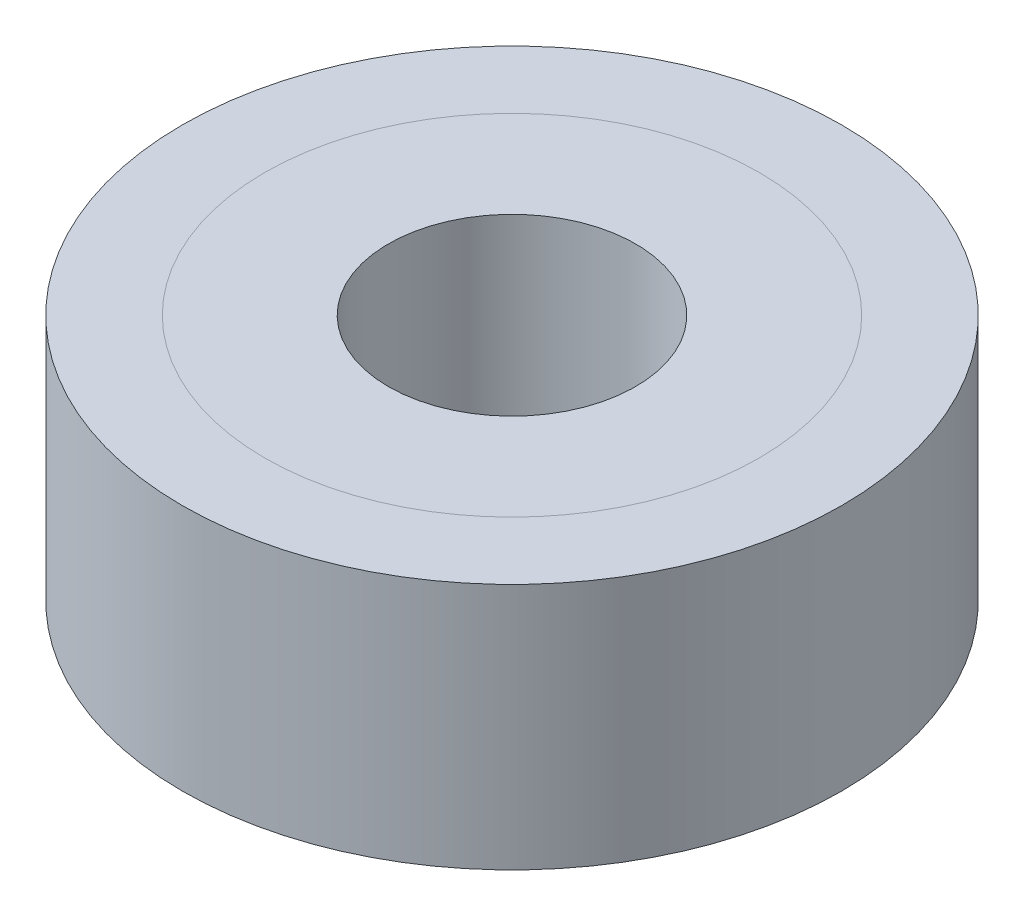
ISO-10303-21;
HEADER;
FILE_DESCRIPTION(('STEP AP214'),'2;1');
FILE_NAME('part.step','',(''),(''),'','','');
FILE_SCHEMA(('AUTOMOTIVE_DESIGN { 1 0 10303 214 1 1 1 1 }'));
ENDSEC;
DATA;
#1=APPLICATION_CONTEXT('core data for automotive mechanical design processes');
#2=APPLICATION_PROTOCOL_DEFINITION('international standard','automotive_design',2000,#1);
#3=PRODUCT_CONTEXT('',#1,'mechanical');
#4=PRODUCT('Part','Part','',(#3));
#5=PRODUCT_RELATED_PRODUCT_CATEGORY('part','',(#4));
#6=PRODUCT_DEFINITION_FORMATION('','',#4);
#7=PRODUCT_DEFINITION_CONTEXT('part definition',#1,'design');
#8=PRODUCT_DEFINITION('design','',#6,#7);
#9=PRODUCT_DEFINITION_SHAPE('','',#8);
#10=(LENGTH_UNIT() NAMED_UNIT(*) SI_UNIT(.MILLI.,.METRE.));
#11=(NAMED_UNIT(*) PLANE_ANGLE_UNIT() SI_UNIT($,.RADIAN.));
#12=(NAMED_UNIT(*) SI_UNIT($,.STERADIAN.) SOLID_ANGLE_UNIT());
#13=UNCERTAINTY_MEASURE_WITH_UNIT(LENGTH_MEASURE(1.E-05),#10,'distance_accuracy_value','');
#14=(GEOMETRIC_REPRESENTATION_CONTEXT(3) GLOBAL_UNCERTAINTY_ASSIGNED_CONTEXT((#13)) GLOBAL_UNIT_ASSIGNED_CONTEXT((#10,
#11,#12)) REPRESENTATION_CONTEXT('',''));
#15=CARTESIAN_POINT('',(0.,0.,0.));
#16=DIRECTION('',(0.,0.,1.));
#17=DIRECTION('',(1.,0.,0.));
#18=AXIS2_PLACEMENT_3D('',#15,#16,#17);
#19=CARTESIAN_POINT('',(0.,-0.01,0.));
#20=DIRECTION('',(0.,1.,0.));
#21=DIRECTION('',(0.,0.,1.));
#22=AXIS2_PLACEMENT_3D('',#19,#20,#21);
#23=CYLINDRICAL_SURFACE('',#22,3.);
#24=CARTESIAN_POINT('',(0.,0.,0.));
#25=DIRECTION('',(0.,1.,0.));
#26=DIRECTION('',(0.,0.,1.));
#27=AXIS2_PLACEMENT_3D('',#24,#25,#26);
#28=CIRCLE('',#27,3.);
#29=CARTESIAN_POINT('',(0.,0.,3.));
#30=VERTEX_POINT('',#29);
#31=EDGE_CURVE('E44',#30,#30,#28,.T.);
#32=ORIENTED_EDGE('',*,*,#31,.T.);
#33=EDGE_LOOP('',(#32));
#34=FACE_BOUND('',#33,.T.);
#35=CARTESIAN_POINT('',(0.,3.,0.));
#36=DIRECTION('',(0.,1.,0.));
#37=DIRECTION('',(0.,0.,1.));
#38=AXIS2_PLACEMENT_3D('',#35,#36,#37);
#39=CIRCLE('',#38,3.);
#40=CARTESIAN_POINT('',(0.,3.,3.));
#41=VERTEX_POINT('',#40);
#42=EDGE_CURVE('E53',#41,#41,#39,.T.);
#43=ORIENTED_EDGE('',*,*,#42,.F.);
#44=EDGE_LOOP('',(#43));
#45=FACE_BOUND('',#44,.T.);
#46=ADVANCED_FACE('F40',(#34,#45),#23,.T.);
#47=CARTESIAN_POINT('',(0.,3.,0.));
#48=DIRECTION('',(0.,1.,0.));
#49=DIRECTION('',(0.,0.,1.));
#50=AXIS2_PLACEMENT_3D('',#47,#48,#49);
#51=PLANE('',#50);
#52=CARTESIAN_POINT('',(0.,3.,0.));
#53=DIRECTION('',(0.,1.,0.));
#54=DIRECTION('',(0.,0.,1.));
#55=AXIS2_PLACEMENT_3D('',#52,#53,#54);
#56=CIRCLE('',#55,1.5);
#57=CARTESIAN_POINT('',(0.,3.,1.5));
#58=VERTEX_POINT('',#57);
#59=EDGE_CURVE('E48',#58,#58,#56,.T.);
#60=ORIENTED_EDGE('',*,*,#59,.F.);
#61=EDGE_LOOP('',(#60));
#62=FACE_BOUND('',#61,.T.);
#63=ORIENTED_EDGE('',*,*,#42,.T.);
#64=EDGE_LOOP('',(#63));
#65=FACE_BOUND('',#64,.T.);
#66=ADVANCED_FACE('F42',(#62,#65),#51,.T.);
#67=CARTESIAN_POINT('',(0.,0.,0.));
#68=DIRECTION('',(0.,1.,0.));
#69=DIRECTION('',(0.,0.,1.));
#70=AXIS2_PLACEMENT_3D('',#67,#68,#69);
#71=PLANE('',#70);
#72=CARTESIAN_POINT('',(0.,0.,0.));
#73=DIRECTION('',(0.,1.,0.));
#74=DIRECTION('',(0.,0.,1.));
#75=AXIS2_PLACEMENT_3D('',#72,#73,#74);
#76=CIRCLE('',#75,1.5);
#77=CARTESIAN_POINT('',(0.,0.,1.5));
#78=VERTEX_POINT('',#77);
#79=EDGE_CURVE('E11',#78,#78,#76,.T.);
#80=ORIENTED_EDGE('',*,*,#79,.T.);
#81=EDGE_LOOP('',(#80));
#82=FACE_BOUND('',#81,.T.);
#83=ORIENTED_EDGE('',*,*,#31,.F.);
#84=EDGE_LOOP('',(#83));
#85=FACE_BOUND('',#84,.T.);
#86=ADVANCED_FACE('F63',(#82,#85),#71,.F.);
#87=CARTESIAN_POINT('',(0.,3.,0.));
#88=DIRECTION('',(0.,-1.,0.));
#89=DIRECTION('',(0.,0.,-1.));
#90=AXIS2_PLACEMENT_3D('',#87,#88,#89);
#91=CYLINDRICAL_SURFACE('',#90,1.5);
#92=ORIENTED_EDGE('',*,*,#59,.T.);
#93=EDGE_LOOP('',(#92));
#94=FACE_BOUND('',#93,.T.);
#95=ORIENTED_EDGE('',*,*,#79,.F.);
#96=EDGE_LOOP('',(#95));
#97=FACE_BOUND('',#96,.T.);
#98=ADVANCED_FACE('F65',(#94,#97),#91,.F.);
#99=CLOSED_SHELL('',(#46,#66,#86,#98));
#100=MANIFOLD_SOLID_BREP('B2',#99);
#101=CARTESIAN_POINT('',(0.,-0.01,0.));
#102=DIRECTION('',(0.,1.,0.));
#103=DIRECTION('',(0.,0.,1.));
#104=AXIS2_PLACEMENT_3D('',#101,#102,#103);
#105=CYLINDRICAL_SURFACE('',#104,3.);
#106=CARTESIAN_POINT('',(0.,3.,0.));
#107=DIRECTION('',(0.,1.,0.));
#108=DIRECTION('',(0.,0.,1.));
#109=AXIS2_PLACEMENT_3D('',#106,#107,#108);
#110=CIRCLE('',#109,3.);
#111=CARTESIAN_POINT('',(0.,3.,3.));
#112=VERTEX_POINT('',#111);
#113=EDGE_CURVE('E39',#112,#112,#110,.T.);
#114=ORIENTED_EDGE('',*,*,#113,.T.);
#115=EDGE_LOOP('',(#114));
#116=FACE_BOUND('',#115,.T.);
#117=CARTESIAN_POINT('',(0.,0.,0.));
#118=DIRECTION('',(0.,1.,0.));
#119=DIRECTION('',(0.,0.,1.));
#120=AXIS2_PLACEMENT_3D('',#117,#118,#119);
#121=CIRCLE('',#120,3.);
#122=CARTESIAN_POINT('',(0.,0.,3.));
#123=VERTEX_POINT('',#122);
#124=EDGE_CURVE('E107',#123,#123,#121,.T.);
#125=ORIENTED_EDGE('',*,*,#124,.F.);
#126=EDGE_LOOP('',(#125));
#127=FACE_BOUND('',#126,.T.);
#128=ADVANCED_FACE('F101',(#116,#127),#105,.F.);
#129=CARTESIAN_POINT('',(0.,3.,0.));
#130=DIRECTION('',(0.,-1.,0.));
#131=DIRECTION('',(0.,0.,-1.));
#132=AXIS2_PLACEMENT_3D('',#129,#130,#131);
#133=CYLINDRICAL_SURFACE('',#132,4.);
#134=CARTESIAN_POINT('',(0.,3.,0.));
#135=DIRECTION('',(0.,1.,0.));
#136=DIRECTION('',(0.,0.,1.));
#137=AXIS2_PLACEMENT_3D('',#134,#135,#136);
#138=CIRCLE('',#137,4.);
#139=CARTESIAN_POINT('',(0.,3.,4.));
#140=VERTEX_POINT('',#139);
#141=EDGE_CURVE('E111',#140,#140,#138,.T.);
#142=ORIENTED_EDGE('',*,*,#141,.F.);
#143=EDGE_LOOP('',(#142));
#144=FACE_BOUND('',#143,.T.);
#145=CARTESIAN_POINT('',(0.,0.,0.));
#146=DIRECTION('',(0.,1.,0.));
#147=DIRECTION('',(0.,0.,1.));
#148=AXIS2_PLACEMENT_3D('',#145,#146,#147);
#149=CIRCLE('',#148,4.);
#150=CARTESIAN_POINT('',(0.,0.,4.));
#151=VERTEX_POINT('',#150);
#152=EDGE_CURVE('E115',#151,#151,#149,.T.);
#153=ORIENTED_EDGE('',*,*,#152,.T.);
#154=EDGE_LOOP('',(#153));
#155=FACE_BOUND('',#154,.T.);
#156=ADVANCED_FACE('F121',(#144,#155),#133,.T.);
#157=CARTESIAN_POINT('',(0.,0.,0.));
#158=DIRECTION('',(0.,1.,0.));
#159=DIRECTION('',(0.,0.,1.));
#160=AXIS2_PLACEMENT_3D('',#157,#158,#159);
#161=PLANE('',#160);
#162=ORIENTED_EDGE('',*,*,#124,.T.);
#163=EDGE_LOOP('',(#162));
#164=FACE_BOUND('',#163,.T.);
#165=ORIENTED_EDGE('',*,*,#152,.F.);
#166=EDGE_LOOP('',(#165));
#167=FACE_BOUND('',#166,.T.);
#168=ADVANCED_FACE('F123',(#164,#167),#161,.F.);
#169=CARTESIAN_POINT('',(0.,3.,0.));
#170=DIRECTION('',(0.,1.,0.));
#171=DIRECTION('',(0.,0.,1.));
#172=AXIS2_PLACEMENT_3D('',#169,#170,#171);
#173=PLANE('',#172);
#174=ORIENTED_EDGE('',*,*,#113,.F.);
#175=EDGE_LOOP('',(#174));
#176=FACE_BOUND('',#175,.T.);
#177=ORIENTED_EDGE('',*,*,#141,.T.);
#178=EDGE_LOOP('',(#177));
#179=FACE_BOUND('',#178,.T.);
#180=ADVANCED_FACE('F125',(#176,#179),#173,.T.);
#181=CLOSED_SHELL('',(#128,#156,#168,#180));
#182=MANIFOLD_SOLID_BREP('B6',#181);
#183=ADVANCED_BREP_SHAPE_REPRESENTATION('',(#18,#100,#182),#14);
#184=SHAPE_DEFINITION_REPRESENTATION(#9,#183);
ENDSEC;
END-ISO-10303-21;
